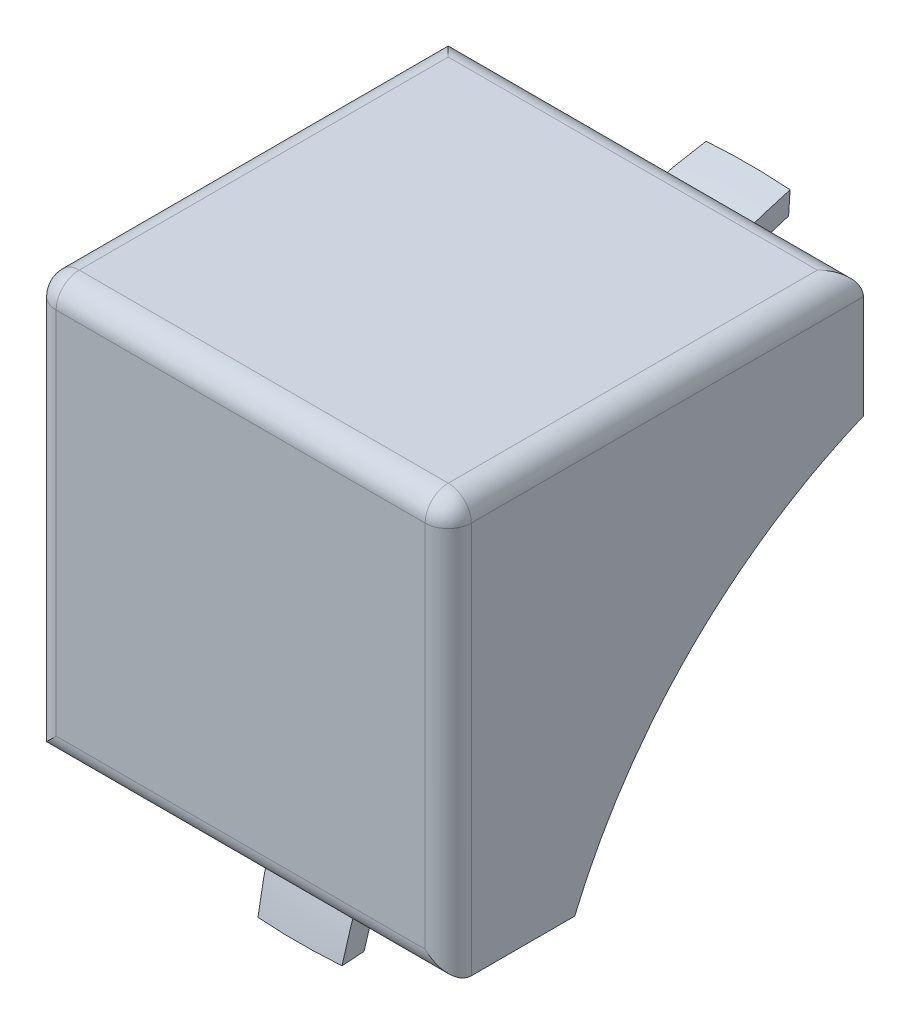
ISO-10303-21;
HEADER;
FILE_DESCRIPTION(('STEP AP214'),'2;1');
FILE_NAME('part.step','',(''),(''),'','','');
FILE_SCHEMA(('AUTOMOTIVE_DESIGN { 1 0 10303 214 1 1 1 1 }'));
ENDSEC;
DATA;
#1=APPLICATION_CONTEXT('core data for automotive mechanical design processes');
#2=APPLICATION_PROTOCOL_DEFINITION('international standard','automotive_design',2000,#1);
#3=PRODUCT_CONTEXT('',#1,'mechanical');
#4=PRODUCT('Part','Part','',(#3));
#5=PRODUCT_RELATED_PRODUCT_CATEGORY('part','',(#4));
#6=PRODUCT_DEFINITION_FORMATION('','',#4);
#7=PRODUCT_DEFINITION_CONTEXT('part definition',#1,'design');
#8=PRODUCT_DEFINITION('design','',#6,#7);
#9=PRODUCT_DEFINITION_SHAPE('','',#8);
#10=(LENGTH_UNIT() NAMED_UNIT(*) SI_UNIT(.MILLI.,.METRE.));
#11=(NAMED_UNIT(*) PLANE_ANGLE_UNIT() SI_UNIT($,.RADIAN.));
#12=(NAMED_UNIT(*) SI_UNIT($,.STERADIAN.) SOLID_ANGLE_UNIT());
#13=UNCERTAINTY_MEASURE_WITH_UNIT(LENGTH_MEASURE(1.E-05),#10,'distance_accuracy_value','');
#14=(GEOMETRIC_REPRESENTATION_CONTEXT(3) GLOBAL_UNCERTAINTY_ASSIGNED_CONTEXT((#13)) GLOBAL_UNIT_ASSIGNED_CONTEXT((#10,
#11,#12)) REPRESENTATION_CONTEXT('',''));
#15=CARTESIAN_POINT('',(0.,0.,0.));
#16=DIRECTION('',(0.,0.,1.));
#17=DIRECTION('',(1.,0.,0.));
#18=AXIS2_PLACEMENT_3D('',#15,#16,#17);
#19=CARTESIAN_POINT('',(-56.25,56.25,56.25));
#20=DIRECTION('',(0.,-1.,0.));
#21=DIRECTION('',(0.,0.,-1.));
#22=AXIS2_PLACEMENT_3D('',#19,#20,#21);
#23=PLANE('',#22);
#24=DIRECTION('',(-1.,0.,0.));
#25=VECTOR('',#24,1.);
#26=CARTESIAN_POINT('',(18.75,56.25,54.1666666666667));
#27=LINE('',#26,#25);
#28=CARTESIAN_POINT('',(-16.6666666666667,56.25,54.1666666666667));
#29=VERTEX_POINT('',#28);
#30=CARTESIAN_POINT('',(16.6666666666667,56.25,54.1666666666667));
#31=VERTEX_POINT('',#30);
#32=EDGE_CURVE('E170',#29,#31,#27,.F.);
#33=ORIENTED_EDGE('',*,*,#32,.T.);
#34=DIRECTION('',(0.,0.,1.));
#35=VECTOR('',#34,1.);
#36=CARTESIAN_POINT('',(16.6666666666666,56.25,56.25));
#37=LINE('',#36,#35);
#38=CARTESIAN_POINT('',(16.6666666666667,56.25,20.8333333333333));
#39=VERTEX_POINT('',#38);
#40=EDGE_CURVE('E69',#31,#39,#37,.F.);
#41=ORIENTED_EDGE('',*,*,#40,.T.);
#42=DIRECTION('',(1.,0.,0.));
#43=VECTOR('',#42,1.);
#44=CARTESIAN_POINT('',(-56.25,56.25,20.8333333333333));
#45=LINE('',#44,#43);
#46=CARTESIAN_POINT('',(-16.6666666666667,56.25,20.8333333333333));
#47=VERTEX_POINT('',#46);
#48=EDGE_CURVE('E172',#39,#47,#45,.F.);
#49=ORIENTED_EDGE('',*,*,#48,.T.);
#50=DIRECTION('',(0.,0.,1.));
#51=VECTOR('',#50,1.);
#52=CARTESIAN_POINT('',(-16.6666666666667,56.25,56.25));
#53=LINE('',#52,#51);
#54=EDGE_CURVE('E168',#47,#29,#53,.T.);
#55=ORIENTED_EDGE('',*,*,#54,.T.);
#56=EDGE_LOOP('',(#33,#41,#49,#55));
#57=FACE_BOUND('',#56,.T.);
#58=ADVANCED_FACE('F46',(#57),#23,.F.);
#59=CARTESIAN_POINT('',(0.,0.,56.25));
#60=DIRECTION('',(0.,0.,1.));
#61=DIRECTION('',(1.,0.,0.));
#62=AXIS2_PLACEMENT_3D('',#59,#60,#61);
#63=PLANE('',#62);
#64=DIRECTION('',(0.,1.,0.));
#65=VECTOR('',#64,1.);
#66=CARTESIAN_POINT('',(-16.6666666666667,18.75,56.25));
#67=LINE('',#66,#65);
#68=CARTESIAN_POINT('',(-16.6666666666667,54.1666666666667,56.25));
#69=VERTEX_POINT('',#68);
#70=CARTESIAN_POINT('',(-16.6666666666667,20.8333333333334,56.25));
#71=VERTEX_POINT('',#70);
#72=EDGE_CURVE('E158',#69,#71,#67,.F.);
#73=ORIENTED_EDGE('',*,*,#72,.T.);
#74=DIRECTION('',(-1.,0.,0.));
#75=VECTOR('',#74,1.);
#76=CARTESIAN_POINT('',(18.75,20.8333333333334,56.25));
#77=LINE('',#76,#75);
#78=CARTESIAN_POINT('',(16.6666666666667,20.8333333333334,56.25));
#79=VERTEX_POINT('',#78);
#80=EDGE_CURVE('E160',#71,#79,#77,.F.);
#81=ORIENTED_EDGE('',*,*,#80,.T.);
#82=DIRECTION('',(0.,-1.,0.));
#83=VECTOR('',#82,1.);
#84=CARTESIAN_POINT('',(16.6666666666667,56.25,56.25));
#85=LINE('',#84,#83);
#86=CARTESIAN_POINT('',(16.6666666666667,54.1666666666667,56.25));
#87=VERTEX_POINT('',#86);
#88=EDGE_CURVE('E154',#79,#87,#85,.F.);
#89=ORIENTED_EDGE('',*,*,#88,.T.);
#90=DIRECTION('',(-1.,0.,0.));
#91=VECTOR('',#90,1.);
#92=CARTESIAN_POINT('',(-18.75,54.1666666666667,56.25));
#93=LINE('',#92,#91);
#94=EDGE_CURVE('E156',#87,#69,#93,.T.);
#95=ORIENTED_EDGE('',*,*,#94,.T.);
#96=EDGE_LOOP('',(#73,#81,#89,#95));
#97=FACE_BOUND('',#96,.T.);
#98=ADVANCED_FACE('F224',(#97),#63,.T.);
#99=CARTESIAN_POINT('',(-18.75,18.75,-56.25));
#100=DIRECTION('',(1.,0.,0.));
#101=DIRECTION('',(0.,0.,-1.));
#102=AXIS2_PLACEMENT_3D('',#99,#100,#101);
#103=PLANE('',#102);
#104=DIRECTION('',(0.,0.,1.));
#105=VECTOR('',#104,1.);
#106=CARTESIAN_POINT('',(-18.75,18.75,-56.25));
#107=LINE('',#106,#105);
#108=CARTESIAN_POINT('',(-18.75,18.75,44.8279891486458));
#109=VERTEX_POINT('',#108);
#110=CARTESIAN_POINT('',(-18.75,18.75,54.1666666666667));
#111=VERTEX_POINT('',#110);
#112=EDGE_CURVE('E130',#109,#111,#107,.T.);
#113=ORIENTED_EDGE('',*,*,#112,.T.);
#114=DIRECTION('',(0.,1.,0.));
#115=VECTOR('',#114,1.);
#116=CARTESIAN_POINT('',(-18.75,56.25,54.1666666666667));
#117=LINE('',#116,#115);
#118=CARTESIAN_POINT('',(-18.75,54.1666666666667,54.1666666666667));
#119=VERTEX_POINT('',#118);
#120=EDGE_CURVE('E165',#111,#119,#117,.T.);
#121=ORIENTED_EDGE('',*,*,#120,.T.);
#122=DIRECTION('',(0.,0.,1.));
#123=VECTOR('',#122,1.);
#124=CARTESIAN_POINT('',(-18.75,54.1666666666667,-56.25));
#125=LINE('',#124,#123);
#126=CARTESIAN_POINT('',(-18.75,54.1666666666667,18.75));
#127=VERTEX_POINT('',#126);
#128=EDGE_CURVE('E163',#119,#127,#125,.F.);
#129=ORIENTED_EDGE('',*,*,#128,.T.);
#130=DIRECTION('',(0.,1.,0.));
#131=VECTOR('',#130,1.);
#132=CARTESIAN_POINT('',(-18.75,18.75,18.75));
#133=LINE('',#132,#131);
#134=CARTESIAN_POINT('',(-18.75,44.8279891486459,18.75));
#135=VERTEX_POINT('',#134);
#136=EDGE_CURVE('E143',#135,#127,#133,.T.);
#137=ORIENTED_EDGE('',*,*,#136,.F.);
#138=CARTESIAN_POINT('',(-18.75,0.,0.));
#139=DIRECTION('',(1.,0.,0.));
#140=DIRECTION('',(0.,0.,-1.));
#141=AXIS2_PLACEMENT_3D('',#138,#139,#140);
#142=CIRCLE('',#141,48.5912657903775);
#143=EDGE_CURVE('E124',#135,#109,#142,.T.);
#144=ORIENTED_EDGE('',*,*,#143,.T.);
#145=EDGE_LOOP('',(#113,#121,#129,#137,#144));
#146=FACE_BOUND('',#145,.T.);
#147=ADVANCED_FACE('F240',(#146),#103,.F.);
#148=CARTESIAN_POINT('',(18.75,18.75,-56.25));
#149=DIRECTION('',(0.,1.,0.));
#150=DIRECTION('',(-1.,0.,0.));
#151=AXIS2_PLACEMENT_3D('',#148,#149,#150);
#152=PLANE('',#151);
#153=DIRECTION('',(0.,0.,1.));
#154=VECTOR('',#153,1.);
#155=CARTESIAN_POINT('',(18.75,18.75,-56.25));
#156=LINE('',#155,#154);
#157=CARTESIAN_POINT('',(18.75,18.75,44.8279891486459));
#158=VERTEX_POINT('',#157);
#159=CARTESIAN_POINT('',(18.75,18.75,54.1666666666667));
#160=VERTEX_POINT('',#159);
#161=EDGE_CURVE('E137',#158,#160,#156,.T.);
#162=ORIENTED_EDGE('',*,*,#161,.T.);
#163=DIRECTION('',(-1.,0.,0.));
#164=VECTOR('',#163,1.);
#165=CARTESIAN_POINT('',(-18.75,18.75,54.1666666666667));
#166=LINE('',#165,#164);
#167=EDGE_CURVE('E129',#160,#111,#166,.T.);
#168=ORIENTED_EDGE('',*,*,#167,.T.);
#169=ORIENTED_EDGE('',*,*,#112,.F.);
#170=CARTESIAN_POINT('',(0.,18.75,0.));
#171=DIRECTION('',(0.,1.,0.));
#172=DIRECTION('',(-1.,0.,0.));
#173=AXIS2_PLACEMENT_3D('',#170,#171,#172);
#174=CIRCLE('',#173,48.5912657903775);
#175=EDGE_CURVE('E138',#109,#158,#174,.T.);
#176=ORIENTED_EDGE('',*,*,#175,.T.);
#177=EDGE_LOOP('',(#162,#168,#169,#176));
#178=FACE_BOUND('',#177,.T.);
#179=ADVANCED_FACE('F237',(#178),#152,.F.);
#180=CARTESIAN_POINT('',(18.75,56.25,-56.25));
#181=DIRECTION('',(-1.,0.,0.));
#182=DIRECTION('',(0.,-1.,0.));
#183=AXIS2_PLACEMENT_3D('',#180,#181,#182);
#184=PLANE('',#183);
#185=DIRECTION('',(0.,1.,0.));
#186=VECTOR('',#185,1.);
#187=CARTESIAN_POINT('',(18.75,18.75,18.75));
#188=LINE('',#187,#186);
#189=CARTESIAN_POINT('',(18.75,44.8279891486459,18.75));
#190=VERTEX_POINT('',#189);
#191=CARTESIAN_POINT('',(18.75,54.1666666666667,18.75));
#192=VERTEX_POINT('',#191);
#193=EDGE_CURVE('E134',#190,#192,#188,.T.);
#194=ORIENTED_EDGE('',*,*,#193,.T.);
#195=DIRECTION('',(0.,0.,1.));
#196=VECTOR('',#195,1.);
#197=CARTESIAN_POINT('',(18.75,54.1666666666667,-56.25));
#198=LINE('',#197,#196);
#199=CARTESIAN_POINT('',(18.75,54.1666666666667,54.1666666666667));
#200=VERTEX_POINT('',#199);
#201=EDGE_CURVE('E12',#192,#200,#198,.T.);
#202=ORIENTED_EDGE('',*,*,#201,.T.);
#203=DIRECTION('',(0.,-1.,0.));
#204=VECTOR('',#203,1.);
#205=CARTESIAN_POINT('',(18.75,18.75,54.1666666666667));
#206=LINE('',#205,#204);
#207=EDGE_CURVE('E55',#200,#160,#206,.T.);
#208=ORIENTED_EDGE('',*,*,#207,.T.);
#209=ORIENTED_EDGE('',*,*,#161,.F.);
#210=CARTESIAN_POINT('',(18.75,0.,0.));
#211=DIRECTION('',(-1.,0.,0.));
#212=DIRECTION('',(0.,-1.,0.));
#213=AXIS2_PLACEMENT_3D('',#210,#211,#212);
#214=CIRCLE('',#213,48.5912657903775);
#215=EDGE_CURVE('E121',#158,#190,#214,.T.);
#216=ORIENTED_EDGE('',*,*,#215,.T.);
#217=EDGE_LOOP('',(#194,#202,#208,#209,#216));
#218=FACE_BOUND('',#217,.T.);
#219=ADVANCED_FACE('F133',(#218),#184,.F.);
#220=CARTESIAN_POINT('',(-18.75,18.75,18.75));
#221=DIRECTION('',(0.,0.,1.));
#222=DIRECTION('',(1.,0.,0.));
#223=AXIS2_PLACEMENT_3D('',#220,#221,#222);
#224=PLANE('',#223);
#225=ORIENTED_EDGE('',*,*,#136,.T.);
#226=DIRECTION('',(1.,0.,0.));
#227=VECTOR('',#226,1.);
#228=CARTESIAN_POINT('',(-18.75,54.1666666666667,18.75));
#229=LINE('',#228,#227);
#230=EDGE_CURVE('E142',#127,#192,#229,.T.);
#231=ORIENTED_EDGE('',*,*,#230,.T.);
#232=ORIENTED_EDGE('',*,*,#193,.F.);
#233=CARTESIAN_POINT('',(0.,0.,18.75));
#234=DIRECTION('',(0.,0.,1.));
#235=DIRECTION('',(1.,0.,0.));
#236=AXIS2_PLACEMENT_3D('',#233,#234,#235);
#237=CIRCLE('',#236,48.5912657903775);
#238=EDGE_CURVE('E118',#190,#135,#237,.T.);
#239=ORIENTED_EDGE('',*,*,#238,.T.);
#240=EDGE_LOOP('',(#225,#231,#232,#239));
#241=FACE_BOUND('',#240,.T.);
#242=ADVANCED_FACE('F140',(#241),#224,.F.);
#243=CARTESIAN_POINT('',(0.,0.,0.));
#244=DIRECTION('',(0.,1.,0.));
#245=DIRECTION('',(0.,0.,-1.));
#246=AXIS2_PLACEMENT_3D('',#243,#244,#245);
#247=SPHERICAL_SURFACE('',#246,52.0833333333333);
#248=ORIENTED_EDGE('',*,*,#238,.F.);
#249=ORIENTED_EDGE('',*,*,#215,.F.);
#250=ORIENTED_EDGE('',*,*,#175,.F.);
#251=ORIENTED_EDGE('',*,*,#143,.F.);
#252=EDGE_LOOP('',(#248,#249,#250,#251));
#253=FACE_BOUND('',#252,.T.);
#254=ADVANCED_FACE('F120',(#253),#247,.F.);
#255=CARTESIAN_POINT('',(-18.75,54.1666666666667,20.8333333333333));
#256=DIRECTION('',(1.,0.,0.));
#257=DIRECTION('',(0.,0.,-1.));
#258=AXIS2_PLACEMENT_3D('',#255,#256,#257);
#259=CYLINDRICAL_SURFACE('',#258,2.08333333333333);
#260=CARTESIAN_POINT('',(-16.6666666666667,54.1666666666667,20.8333333333333));
#261=DIRECTION('',(-0.707106781186547,0.,0.707106781186547));
#262=DIRECTION('',(0.707106781186547,0.,0.707106781186547));
#263=AXIS2_PLACEMENT_3D('',#260,#261,#262);
#264=ELLIPSE('',#263,2.94627825494395,2.08333333333333);
#265=EDGE_CURVE('E197',#47,#127,#264,.T.);
#266=ORIENTED_EDGE('',*,*,#265,.F.);
#267=ORIENTED_EDGE('',*,*,#48,.F.);
#268=CARTESIAN_POINT('',(16.6666666666667,54.1666666666667,20.8333333333333));
#269=DIRECTION('',(0.707106781186547,0.,0.707106781186547));
#270=DIRECTION('',(-0.707106781186547,0.,0.707106781186547));
#271=AXIS2_PLACEMENT_3D('',#268,#269,#270);
#272=ELLIPSE('',#271,2.94627825494395,2.08333333333333);
#273=EDGE_CURVE('E50',#192,#39,#272,.T.);
#274=ORIENTED_EDGE('',*,*,#273,.F.);
#275=ORIENTED_EDGE('',*,*,#230,.F.);
#276=EDGE_LOOP('',(#266,#267,#274,#275));
#277=FACE_BOUND('',#276,.T.);
#278=ADVANCED_FACE('F48',(#277),#259,.T.);
#279=CARTESIAN_POINT('',(16.6666666666667,54.1666666666667,-56.25));
#280=DIRECTION('',(0.,0.,1.));
#281=DIRECTION('',(1.,0.,0.));
#282=AXIS2_PLACEMENT_3D('',#279,#280,#281);
#283=CYLINDRICAL_SURFACE('',#282,2.08333333333333);
#284=ORIENTED_EDGE('',*,*,#273,.T.);
#285=ORIENTED_EDGE('',*,*,#40,.F.);
#286=CARTESIAN_POINT('',(16.6666666666667,54.1666666666667,54.1666666666667));
#287=DIRECTION('',(0.,0.,1.));
#288=DIRECTION('',(1.,0.,0.));
#289=AXIS2_PLACEMENT_3D('',#286,#287,#288);
#290=CIRCLE('',#289,2.08333333333333);
#291=EDGE_CURVE('E192',#200,#31,#290,.T.);
#292=ORIENTED_EDGE('',*,*,#291,.F.);
#293=ORIENTED_EDGE('',*,*,#201,.F.);
#294=EDGE_LOOP('',(#284,#285,#292,#293));
#295=FACE_BOUND('',#294,.T.);
#296=ADVANCED_FACE('F204',(#295),#283,.T.);
#297=CARTESIAN_POINT('',(-16.6666666666667,54.1666666666667,56.25));
#298=DIRECTION('',(0.,0.,1.));
#299=DIRECTION('',(1.,0.,0.));
#300=AXIS2_PLACEMENT_3D('',#297,#298,#299);
#301=CYLINDRICAL_SURFACE('',#300,2.08333333333333);
#302=ORIENTED_EDGE('',*,*,#265,.T.);
#303=ORIENTED_EDGE('',*,*,#128,.F.);
#304=CARTESIAN_POINT('',(-16.6666666666667,54.1666666666667,54.1666666666667));
#305=DIRECTION('',(0.,0.,1.));
#306=DIRECTION('',(1.,0.,0.));
#307=AXIS2_PLACEMENT_3D('',#304,#305,#306);
#308=CIRCLE('',#307,2.08333333333333);
#309=EDGE_CURVE('E189',#29,#119,#308,.T.);
#310=ORIENTED_EDGE('',*,*,#309,.F.);
#311=ORIENTED_EDGE('',*,*,#54,.F.);
#312=EDGE_LOOP('',(#302,#303,#310,#311));
#313=FACE_BOUND('',#312,.T.);
#314=ADVANCED_FACE('F214',(#313),#301,.T.);
#315=CARTESIAN_POINT('',(0.,54.1666666666667,54.1666666666667));
#316=DIRECTION('',(1.,0.,0.));
#317=DIRECTION('',(0.,0.,-1.));
#318=AXIS2_PLACEMENT_3D('',#315,#316,#317);
#319=CYLINDRICAL_SURFACE('',#318,2.08333333333333);
#320=CARTESIAN_POINT('',(16.6666666666667,54.1666666666667,54.1666666666667));
#321=DIRECTION('',(1.,0.,0.));
#322=DIRECTION('',(0.,0.,-1.));
#323=AXIS2_PLACEMENT_3D('',#320,#321,#322);
#324=CIRCLE('',#323,2.08333333333333);
#325=EDGE_CURVE('E195',#31,#87,#324,.T.);
#326=ORIENTED_EDGE('',*,*,#325,.F.);
#327=ORIENTED_EDGE('',*,*,#32,.F.);
#328=CARTESIAN_POINT('',(-16.6666666666667,54.1666666666667,54.1666666666667));
#329=DIRECTION('',(-1.,0.,0.));
#330=DIRECTION('',(0.,0.,1.));
#331=AXIS2_PLACEMENT_3D('',#328,#329,#330);
#332=CIRCLE('',#331,2.08333333333333);
#333=EDGE_CURVE('E186',#69,#29,#332,.T.);
#334=ORIENTED_EDGE('',*,*,#333,.F.);
#335=ORIENTED_EDGE('',*,*,#94,.F.);
#336=EDGE_LOOP('',(#326,#327,#334,#335));
#337=FACE_BOUND('',#336,.T.);
#338=ADVANCED_FACE('F211',(#337),#319,.T.);
#339=CARTESIAN_POINT('',(16.6666666666667,54.1666666666667,54.1666666666667));
#340=DIRECTION('',(0.,0.,1.));
#341=DIRECTION('',(1.,0.,0.));
#342=AXIS2_PLACEMENT_3D('',#339,#340,#341);
#343=SPHERICAL_SURFACE('',#342,2.08333333333333);
#344=ORIENTED_EDGE('',*,*,#291,.T.);
#345=ORIENTED_EDGE('',*,*,#325,.T.);
#346=CARTESIAN_POINT('',(16.6666666666667,54.1666666666667,54.1666666666667));
#347=DIRECTION('',(0.,1.,0.));
#348=DIRECTION('',(0.,0.,1.));
#349=AXIS2_PLACEMENT_3D('',#346,#347,#348);
#350=CIRCLE('',#349,2.08333333333333);
#351=EDGE_CURVE('E183',#200,#87,#350,.F.);
#352=ORIENTED_EDGE('',*,*,#351,.F.);
#353=EDGE_LOOP('',(#344,#345,#352));
#354=FACE_BOUND('',#353,.T.);
#355=ADVANCED_FACE('F235',(#354),#343,.T.);
#356=CARTESIAN_POINT('',(-16.6666666666667,54.1666666666667,54.1666666666667));
#357=DIRECTION('',(0.,0.,1.));
#358=DIRECTION('',(1.,0.,0.));
#359=AXIS2_PLACEMENT_3D('',#356,#357,#358);
#360=SPHERICAL_SURFACE('',#359,2.08333333333333);
#361=ORIENTED_EDGE('',*,*,#333,.T.);
#362=ORIENTED_EDGE('',*,*,#309,.T.);
#363=CARTESIAN_POINT('',(-16.6666666666667,54.1666666666667,54.1666666666667));
#364=DIRECTION('',(0.,1.,0.));
#365=DIRECTION('',(0.,0.,1.));
#366=AXIS2_PLACEMENT_3D('',#363,#364,#365);
#367=CIRCLE('',#366,2.08333333333333);
#368=EDGE_CURVE('E180',#69,#119,#367,.F.);
#369=ORIENTED_EDGE('',*,*,#368,.F.);
#370=EDGE_LOOP('',(#361,#362,#369));
#371=FACE_BOUND('',#370,.T.);
#372=ADVANCED_FACE('F216',(#371),#360,.T.);
#373=CARTESIAN_POINT('',(16.6666666666667,56.25,54.1666666666667));
#374=DIRECTION('',(0.,1.,0.));
#375=DIRECTION('',(-1.,0.,0.));
#376=AXIS2_PLACEMENT_3D('',#373,#374,#375);
#377=CYLINDRICAL_SURFACE('',#376,2.08333333333333);
#378=ORIENTED_EDGE('',*,*,#351,.T.);
#379=ORIENTED_EDGE('',*,*,#88,.F.);
#380=CARTESIAN_POINT('',(16.6666666666667,20.8333333333334,54.1666666666667));
#381=DIRECTION('',(0.707106781186547,0.707106781186548,0.));
#382=DIRECTION('',(-0.707106781186548,0.707106781186547,0.));
#383=AXIS2_PLACEMENT_3D('',#380,#381,#382);
#384=ELLIPSE('',#383,2.94627825494395,2.08333333333333);
#385=EDGE_CURVE('E178',#160,#79,#384,.F.);
#386=ORIENTED_EDGE('',*,*,#385,.F.);
#387=ORIENTED_EDGE('',*,*,#207,.F.);
#388=EDGE_LOOP('',(#378,#379,#386,#387));
#389=FACE_BOUND('',#388,.T.);
#390=ADVANCED_FACE('F232',(#389),#377,.T.);
#391=CARTESIAN_POINT('',(-16.6666666666667,18.75,54.1666666666667));
#392=DIRECTION('',(0.,-1.,0.));
#393=DIRECTION('',(0.,0.,-1.));
#394=AXIS2_PLACEMENT_3D('',#391,#392,#393);
#395=CYLINDRICAL_SURFACE('',#394,2.08333333333333);
#396=ORIENTED_EDGE('',*,*,#368,.T.);
#397=ORIENTED_EDGE('',*,*,#120,.F.);
#398=CARTESIAN_POINT('',(-16.6666666666667,20.8333333333334,54.1666666666667));
#399=DIRECTION('',(0.707106781186548,-0.707106781186547,0.));
#400=DIRECTION('',(-0.707106781186547,-0.707106781186548,0.));
#401=AXIS2_PLACEMENT_3D('',#398,#399,#400);
#402=ELLIPSE('',#401,2.94627825494395,2.08333333333333);
#403=EDGE_CURVE('E176',#71,#111,#402,.T.);
#404=ORIENTED_EDGE('',*,*,#403,.F.);
#405=ORIENTED_EDGE('',*,*,#72,.F.);
#406=EDGE_LOOP('',(#396,#397,#404,#405));
#407=FACE_BOUND('',#406,.T.);
#408=ADVANCED_FACE('F221',(#407),#395,.T.);
#409=CARTESIAN_POINT('',(18.75,20.8333333333334,54.1666666666667));
#410=DIRECTION('',(1.,0.,0.));
#411=DIRECTION('',(0.,1.,0.));
#412=AXIS2_PLACEMENT_3D('',#409,#410,#411);
#413=CYLINDRICAL_SURFACE('',#412,2.08333333333333);
#414=ORIENTED_EDGE('',*,*,#385,.T.);
#415=ORIENTED_EDGE('',*,*,#80,.F.);
#416=ORIENTED_EDGE('',*,*,#403,.T.);
#417=ORIENTED_EDGE('',*,*,#167,.F.);
#418=EDGE_LOOP('',(#414,#415,#416,#417));
#419=FACE_BOUND('',#418,.T.);
#420=ADVANCED_FACE('F226',(#419),#413,.T.);
#421=CLOSED_SHELL('',(#58,#98,#147,#179,#219,#242,#254,#278,#296,#314,#338,#355,#372,#390,#408,#420));
#422=MANIFOLD_SOLID_BREP('B2',#421);
#423=CARTESIAN_POINT('',(0.,0.,0.));
#424=DIRECTION('',(0.,-0.707106781186549,0.707106781186546));
#425=DIRECTION('',(0.0871557427476584,0.704416026402757,0.70441602640276));
#426=AXIS2_PLACEMENT_3D('',#423,#424,#425);
#427=SPHERICAL_SURFACE('',#426,52.0833333333333);
#428=CARTESIAN_POINT('',(0.,0.,0.));
#429=DIRECTION('',(0.996194698091746,-0.0616284167162194,-0.0616284167162196));
#430=DIRECTION('',(-0.0616284167162196,0.00190265095412721,-0.998097349045873));
#431=AXIS2_PLACEMENT_3D('',#428,#429,#430);
#432=CIRCLE('',#431,52.0833333333333);
#433=CARTESIAN_POINT('',(3.79265914246824,50.8899047286957,10.4166666666667));
#434=VERTEX_POINT('',#433);
#435=CARTESIAN_POINT('',(3.79265914246825,10.4166666666667,50.8899047286957));
#436=VERTEX_POINT('',#435);
#437=EDGE_CURVE('E415',#434,#436,#432,.T.);
#438=ORIENTED_EDGE('',*,*,#437,.F.);
#439=CARTESIAN_POINT('',(0.,0.,10.4166666666667));
#440=DIRECTION('',(0.,0.,1.));
#441=DIRECTION('',(1.,0.,0.));
#442=AXIS2_PLACEMENT_3D('',#439,#440,#441);
#443=CIRCLE('',#442,51.0310363079829);
#444=CARTESIAN_POINT('',(-3.79265914246824,50.8899047286956,10.4166666666667));
#445=VERTEX_POINT('',#444);
#446=EDGE_CURVE('E409',#434,#445,#443,.T.);
#447=ORIENTED_EDGE('',*,*,#446,.T.);
#448=CARTESIAN_POINT('',(0.,0.,0.));
#449=DIRECTION('',(0.996194698091746,0.0616284167162194,0.0616284167162196));
#450=DIRECTION('',(0.0616284167162196,0.00190265095412723,-0.998097349045873));
#451=AXIS2_PLACEMENT_3D('',#448,#449,#450);
#452=CIRCLE('',#451,52.0833333333333);
#453=CARTESIAN_POINT('',(-3.79265914246825,10.4166666666667,50.8899047286956));
#454=VERTEX_POINT('',#453);
#455=EDGE_CURVE('E391',#445,#454,#452,.T.);
#456=ORIENTED_EDGE('',*,*,#455,.T.);
#457=CARTESIAN_POINT('',(0.,10.4166666666667,0.));
#458=DIRECTION('',(0.,-1.,0.));
#459=DIRECTION('',(0.,0.,-1.));
#460=AXIS2_PLACEMENT_3D('',#457,#458,#459);
#461=CIRCLE('',#460,51.0310363079829);
#462=EDGE_CURVE('E425',#436,#454,#461,.T.);
#463=ORIENTED_EDGE('',*,*,#462,.F.);
#464=EDGE_LOOP('',(#438,#447,#456,#463));
#465=FACE_BOUND('',#464,.T.);
#466=ADVANCED_FACE('F369',(#465),#427,.T.);
#467=CARTESIAN_POINT('',(0.,0.,0.));
#468=DIRECTION('',(0.,-0.707106781186549,0.707106781186546));
#469=DIRECTION('',(0.0871557427476584,0.704416026402757,0.70441602640276));
#470=AXIS2_PLACEMENT_3D('',#467,#468,#469);
#471=SPHERICAL_SURFACE('',#470,50.);
#472=CARTESIAN_POINT('',(0.,0.,0.));
#473=DIRECTION('',(-0.996194698091746,-0.0616284167162194,-0.0616284167162196));
#474=DIRECTION('',(0.0616284167162196,0.00190265095412723,-0.998097349045873));
#475=AXIS2_PLACEMENT_3D('',#472,#473,#474);
#476=CIRCLE('',#475,50.);
#477=CARTESIAN_POINT('',(-3.66124444031378,10.4166666666667,48.7656471781502));
#478=VERTEX_POINT('',#477);
#479=CARTESIAN_POINT('',(-3.66124444031377,48.7656471781502,10.4166666666667));
#480=VERTEX_POINT('',#479);
#481=EDGE_CURVE('E420',#478,#480,#476,.T.);
#482=ORIENTED_EDGE('',*,*,#481,.T.);
#483=CARTESIAN_POINT('',(0.,0.,10.4166666666667));
#484=DIRECTION('',(0.,0.,1.));
#485=DIRECTION('',(1.,0.,0.));
#486=AXIS2_PLACEMENT_3D('',#483,#484,#485);
#487=CIRCLE('',#486,48.9028941429396);
#488=CARTESIAN_POINT('',(3.66124444031377,48.7656471781502,10.4166666666667));
#489=VERTEX_POINT('',#488);
#490=EDGE_CURVE('E384',#480,#489,#487,.F.);
#491=ORIENTED_EDGE('',*,*,#490,.T.);
#492=CARTESIAN_POINT('',(0.,0.,0.));
#493=DIRECTION('',(-0.996194698091746,0.0616284167162194,0.0616284167162196));
#494=DIRECTION('',(-0.0616284167162196,0.00190265095412721,-0.998097349045873));
#495=AXIS2_PLACEMENT_3D('',#492,#493,#494);
#496=CIRCLE('',#495,50.);
#497=CARTESIAN_POINT('',(3.66124444031378,10.4166666666667,48.7656471781502));
#498=VERTEX_POINT('',#497);
#499=EDGE_CURVE('E430',#498,#489,#496,.T.);
#500=ORIENTED_EDGE('',*,*,#499,.F.);
#501=CARTESIAN_POINT('',(0.,10.4166666666667,0.));
#502=DIRECTION('',(0.,-1.,0.));
#503=DIRECTION('',(0.,0.,-1.));
#504=AXIS2_PLACEMENT_3D('',#501,#502,#503);
#505=CIRCLE('',#504,48.9028941429396);
#506=EDGE_CURVE('E436',#478,#498,#505,.F.);
#507=ORIENTED_EDGE('',*,*,#506,.F.);
#508=EDGE_LOOP('',(#482,#491,#500,#507));
#509=FACE_BOUND('',#508,.T.);
#510=ADVANCED_FACE('F371',(#509),#471,.F.);
#511=CARTESIAN_POINT('',(0.,0.,0.));
#512=DIRECTION('',(0.996194698091746,-0.0616284167162194,-0.0616284167162196));
#513=DIRECTION('',(-0.0616284167162196,0.00190265095412721,-0.998097349045873));
#514=AXIS2_PLACEMENT_3D('',#511,#512,#513);
#515=PLANE('',#514);
#516=DIRECTION('',(-0.0617457854184491,-0.998091908585106,0.));
#517=VECTOR('',#516,1.);
#518=CARTESIAN_POINT('',(0.641958008493609,-0.0397139793431373,10.4166666666667));
#519=LINE('',#518,#517);
#520=EDGE_CURVE('E416',#434,#489,#519,.T.);
#521=ORIENTED_EDGE('',*,*,#520,.F.);
#522=ORIENTED_EDGE('',*,*,#437,.T.);
#523=DIRECTION('',(-0.0617457854184493,0.,-0.998091908585106));
#524=VECTOR('',#523,1.);
#525=CARTESIAN_POINT('',(0.641958008493607,10.4166666666667,-0.0397139793431373));
#526=LINE('',#525,#524);
#527=EDGE_CURVE('E421',#436,#498,#526,.T.);
#528=ORIENTED_EDGE('',*,*,#527,.T.);
#529=ORIENTED_EDGE('',*,*,#499,.T.);
#530=EDGE_LOOP('',(#521,#522,#528,#529));
#531=FACE_BOUND('',#530,.T.);
#532=ADVANCED_FACE('F443',(#531),#515,.T.);
#533=CARTESIAN_POINT('',(0.,0.,0.));
#534=DIRECTION('',(0.996194698091746,0.0616284167162194,0.0616284167162196));
#535=DIRECTION('',(0.0616284167162196,0.00190265095412723,-0.998097349045873));
#536=AXIS2_PLACEMENT_3D('',#533,#534,#535);
#537=PLANE('',#536);
#538=ORIENTED_EDGE('',*,*,#455,.F.);
#539=DIRECTION('',(0.0617457854184491,-0.998091908585106,0.));
#540=VECTOR('',#539,1.);
#541=CARTESIAN_POINT('',(-0.641958008493609,-0.0397139793431373,10.4166666666667));
#542=LINE('',#541,#540);
#543=EDGE_CURVE('E44',#445,#480,#542,.T.);
#544=ORIENTED_EDGE('',*,*,#543,.T.);
#545=ORIENTED_EDGE('',*,*,#481,.F.);
#546=DIRECTION('',(0.0617457854184493,0.,-0.998091908585106));
#547=VECTOR('',#546,1.);
#548=CARTESIAN_POINT('',(-0.641958008493607,10.4166666666667,-0.0397139793431373));
#549=LINE('',#548,#547);
#550=EDGE_CURVE('E377',#454,#478,#549,.T.);
#551=ORIENTED_EDGE('',*,*,#550,.F.);
#552=EDGE_LOOP('',(#538,#544,#545,#551));
#553=FACE_BOUND('',#552,.T.);
#554=ADVANCED_FACE('F419',(#553),#537,.F.);
#555=CARTESIAN_POINT('',(0.,10.4166666666667,0.));
#556=DIRECTION('',(0.,-1.,0.));
#557=DIRECTION('',(0.,0.,-1.));
#558=AXIS2_PLACEMENT_3D('',#555,#556,#557);
#559=PLANE('',#558);
#560=ORIENTED_EDGE('',*,*,#462,.T.);
#561=ORIENTED_EDGE('',*,*,#550,.T.);
#562=ORIENTED_EDGE('',*,*,#506,.T.);
#563=ORIENTED_EDGE('',*,*,#527,.F.);
#564=EDGE_LOOP('',(#560,#561,#562,#563));
#565=FACE_BOUND('',#564,.T.);
#566=ADVANCED_FACE('F434',(#565),#559,.T.);
#567=CARTESIAN_POINT('',(0.,0.,10.4166666666667));
#568=DIRECTION('',(0.,0.,1.));
#569=DIRECTION('',(1.,0.,0.));
#570=AXIS2_PLACEMENT_3D('',#567,#568,#569);
#571=PLANE('',#570);
#572=ORIENTED_EDGE('',*,*,#520,.T.);
#573=ORIENTED_EDGE('',*,*,#490,.F.);
#574=ORIENTED_EDGE('',*,*,#543,.F.);
#575=ORIENTED_EDGE('',*,*,#446,.F.);
#576=EDGE_LOOP('',(#572,#573,#574,#575));
#577=FACE_BOUND('',#576,.T.);
#578=ADVANCED_FACE('F408',(#577),#571,.F.);
#579=CLOSED_SHELL('',(#466,#510,#532,#554,#566,#578));
#580=MANIFOLD_SOLID_BREP('B6',#579);
#581=ADVANCED_BREP_SHAPE_REPRESENTATION('',(#18,#422,#580),#14);
#582=SHAPE_DEFINITION_REPRESENTATION(#9,#581);
ENDSEC;
END-ISO-10303-21;
